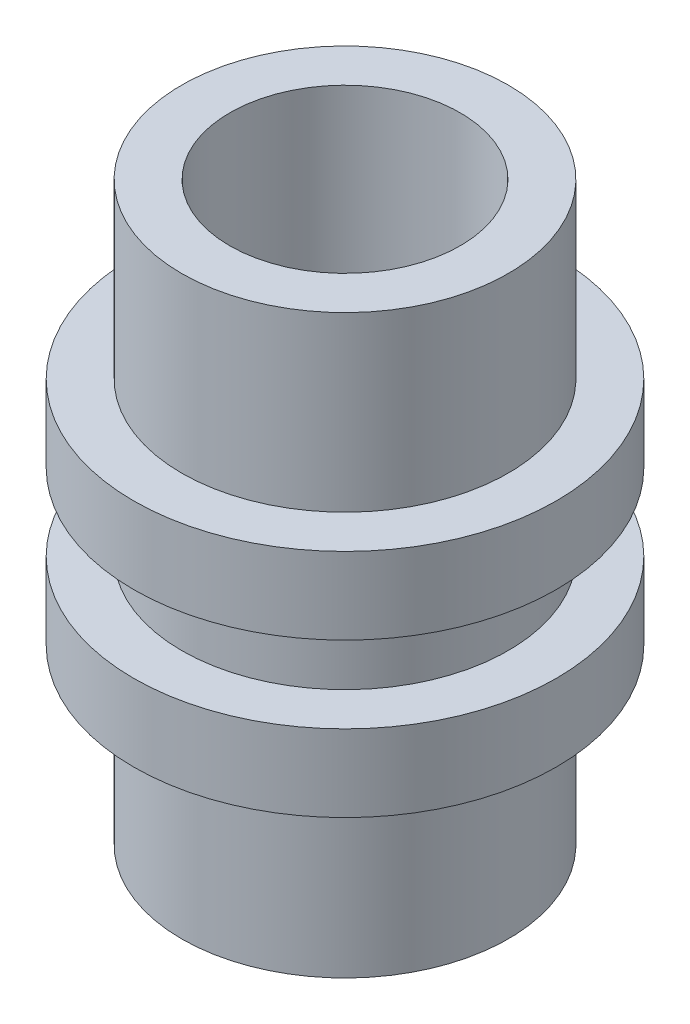
ISO-10303-21;
HEADER;
FILE_DESCRIPTION(('STEP AP214'),'2;1');
FILE_NAME('part.step','',(''),(''),'','','');
FILE_SCHEMA(('AUTOMOTIVE_DESIGN { 1 0 10303 214 1 1 1 1 }'));
ENDSEC;
DATA;
#1=APPLICATION_CONTEXT('core data for automotive mechanical design processes');
#2=APPLICATION_PROTOCOL_DEFINITION('international standard','automotive_design',2000,#1);
#3=PRODUCT_CONTEXT('',#1,'mechanical');
#4=PRODUCT('Part','Part','',(#3));
#5=PRODUCT_RELATED_PRODUCT_CATEGORY('part','',(#4));
#6=PRODUCT_DEFINITION_FORMATION('','',#4);
#7=PRODUCT_DEFINITION_CONTEXT('part definition',#1,'design');
#8=PRODUCT_DEFINITION('design','',#6,#7);
#9=PRODUCT_DEFINITION_SHAPE('','',#8);
#10=(LENGTH_UNIT() NAMED_UNIT(*) SI_UNIT(.MILLI.,.METRE.));
#11=(NAMED_UNIT(*) PLANE_ANGLE_UNIT() SI_UNIT($,.RADIAN.));
#12=(NAMED_UNIT(*) SI_UNIT($,.STERADIAN.) SOLID_ANGLE_UNIT());
#13=UNCERTAINTY_MEASURE_WITH_UNIT(LENGTH_MEASURE(1.E-05),#10,'distance_accuracy_value','');
#14=(GEOMETRIC_REPRESENTATION_CONTEXT(3) GLOBAL_UNCERTAINTY_ASSIGNED_CONTEXT((#13)) GLOBAL_UNIT_ASSIGNED_CONTEXT((#10,
#11,#12)) REPRESENTATION_CONTEXT('',''));
#15=CARTESIAN_POINT('',(0.,0.,0.));
#16=DIRECTION('',(0.,0.,1.));
#17=DIRECTION('',(1.,0.,0.));
#18=AXIS2_PLACEMENT_3D('',#15,#16,#17);
#19=CARTESIAN_POINT('',(0.,6.,0.));
#20=DIRECTION('',(0.,-1.,0.));
#21=DIRECTION('',(0.,0.,-1.));
#22=AXIS2_PLACEMENT_3D('',#19,#20,#21);
#23=CYLINDRICAL_SURFACE('',#22,5.5);
#24=CARTESIAN_POINT('',(0.,0.,0.));
#25=DIRECTION('',(0.,1.,0.));
#26=DIRECTION('',(0.,0.,1.));
#27=AXIS2_PLACEMENT_3D('',#24,#25,#26);
#28=CIRCLE('',#27,5.5);
#29=CARTESIAN_POINT('',(0.,0.,5.5));
#30=VERTEX_POINT('',#29);
#31=EDGE_CURVE('E52',#30,#30,#28,.T.);
#32=ORIENTED_EDGE('',*,*,#31,.T.);
#33=EDGE_LOOP('',(#32));
#34=FACE_BOUND('',#33,.T.);
#35=CARTESIAN_POINT('',(0.,2.,0.));
#36=DIRECTION('',(0.,1.,0.));
#37=DIRECTION('',(0.,0.,1.));
#38=AXIS2_PLACEMENT_3D('',#35,#36,#37);
#39=CIRCLE('',#38,5.5);
#40=CARTESIAN_POINT('',(0.,2.,5.5));
#41=VERTEX_POINT('',#40);
#42=EDGE_CURVE('E73',#41,#41,#39,.T.);
#43=ORIENTED_EDGE('',*,*,#42,.F.);
#44=EDGE_LOOP('',(#43));
#45=FACE_BOUND('',#44,.T.);
#46=ADVANCED_FACE('F32',(#34,#45),#23,.T.);
#47=CARTESIAN_POINT('',(0.,0.,0.));
#48=DIRECTION('',(0.,1.,0.));
#49=DIRECTION('',(0.,0.,1.));
#50=AXIS2_PLACEMENT_3D('',#47,#48,#49);
#51=PLANE('',#50);
#52=ORIENTED_EDGE('',*,*,#31,.F.);
#53=EDGE_LOOP('',(#52));
#54=FACE_BOUND('',#53,.T.);
#55=CARTESIAN_POINT('',(0.,0.,0.));
#56=DIRECTION('',(0.,1.,0.));
#57=DIRECTION('',(0.,0.,1.));
#58=AXIS2_PLACEMENT_3D('',#55,#56,#57);
#59=CIRCLE('',#58,4.25);
#60=CARTESIAN_POINT('',(0.,0.,4.25));
#61=VERTEX_POINT('',#60);
#62=EDGE_CURVE('E36',#61,#61,#59,.F.);
#63=ORIENTED_EDGE('',*,*,#62,.F.);
#64=EDGE_LOOP('',(#63));
#65=FACE_BOUND('',#64,.T.);
#66=ADVANCED_FACE('F105',(#54,#65),#51,.F.);
#67=CARTESIAN_POINT('',(0.,10.5,0.));
#68=DIRECTION('',(0.,-1.,0.));
#69=DIRECTION('',(0.,0.,-1.));
#70=AXIS2_PLACEMENT_3D('',#67,#68,#69);
#71=CYLINDRICAL_SURFACE('',#70,4.25);
#72=CARTESIAN_POINT('',(0.,-4.5,0.));
#73=DIRECTION('',(0.,1.,0.));
#74=DIRECTION('',(0.,0.,1.));
#75=AXIS2_PLACEMENT_3D('',#72,#73,#74);
#76=CIRCLE('',#75,4.25);
#77=CARTESIAN_POINT('',(0.,-4.5,4.25));
#78=VERTEX_POINT('',#77);
#79=EDGE_CURVE('E65',#78,#78,#76,.F.);
#80=ORIENTED_EDGE('',*,*,#79,.F.);
#81=EDGE_LOOP('',(#80));
#82=FACE_BOUND('',#81,.T.);
#83=ORIENTED_EDGE('',*,*,#62,.T.);
#84=EDGE_LOOP('',(#83));
#85=FACE_BOUND('',#84,.T.);
#86=ADVANCED_FACE('F110',(#82,#85),#71,.T.);
#87=CARTESIAN_POINT('',(0.,-4.5,0.));
#88=DIRECTION('',(0.,1.,0.));
#89=DIRECTION('',(0.,0.,1.));
#90=AXIS2_PLACEMENT_3D('',#87,#88,#89);
#91=PLANE('',#90);
#92=ORIENTED_EDGE('',*,*,#79,.T.);
#93=EDGE_LOOP('',(#92));
#94=FACE_BOUND('',#93,.T.);
#95=CARTESIAN_POINT('',(0.,-4.5,0.));
#96=DIRECTION('',(0.,1.,0.));
#97=DIRECTION('',(0.,0.,1.));
#98=AXIS2_PLACEMENT_3D('',#95,#96,#97);
#99=CIRCLE('',#98,3.);
#100=CARTESIAN_POINT('',(0.,-4.5,3.));
#101=VERTEX_POINT('',#100);
#102=EDGE_CURVE('E69',#101,#101,#99,.F.);
#103=ORIENTED_EDGE('',*,*,#102,.F.);
#104=EDGE_LOOP('',(#103));
#105=FACE_BOUND('',#104,.T.);
#106=ADVANCED_FACE('F137',(#94,#105),#91,.F.);
#107=CARTESIAN_POINT('',(0.,10.5,0.));
#108=DIRECTION('',(0.,-1.,0.));
#109=DIRECTION('',(0.,0.,-1.));
#110=AXIS2_PLACEMENT_3D('',#107,#108,#109);
#111=CYLINDRICAL_SURFACE('',#110,3.);
#112=ORIENTED_EDGE('',*,*,#102,.T.);
#113=EDGE_LOOP('',(#112));
#114=FACE_BOUND('',#113,.T.);
#115=CARTESIAN_POINT('',(0.,0.,0.));
#116=DIRECTION('',(0.,1.,0.));
#117=DIRECTION('',(0.,0.,1.));
#118=AXIS2_PLACEMENT_3D('',#115,#116,#117);
#119=CIRCLE('',#118,3.);
#120=CARTESIAN_POINT('',(0.,0.,3.));
#121=VERTEX_POINT('',#120);
#122=EDGE_CURVE('E53',#121,#121,#119,.F.);
#123=ORIENTED_EDGE('',*,*,#122,.F.);
#124=EDGE_LOOP('',(#123));
#125=FACE_BOUND('',#124,.T.);
#126=ADVANCED_FACE('F142',(#114,#125),#111,.F.);
#127=ORIENTED_EDGE('',*,*,#122,.T.);
#128=EDGE_LOOP('',(#127));
#129=FACE_BOUND('',#128,.T.);
#130=ADVANCED_FACE('F113',(#129),#51,.F.);
#131=CARTESIAN_POINT('',(0.,2.,0.));
#132=DIRECTION('',(0.,1.,0.));
#133=DIRECTION('',(0.,0.,1.));
#134=AXIS2_PLACEMENT_3D('',#131,#132,#133);
#135=PLANE('',#134);
#136=CARTESIAN_POINT('',(0.,2.,0.));
#137=DIRECTION('',(0.,1.,0.));
#138=DIRECTION('',(0.,0.,1.));
#139=AXIS2_PLACEMENT_3D('',#136,#137,#138);
#140=CIRCLE('',#139,4.25);
#141=CARTESIAN_POINT('',(0.,2.,4.25));
#142=VERTEX_POINT('',#141);
#143=EDGE_CURVE('E80',#142,#142,#140,.T.);
#144=ORIENTED_EDGE('',*,*,#143,.F.);
#145=EDGE_LOOP('',(#144));
#146=FACE_BOUND('',#145,.T.);
#147=ORIENTED_EDGE('',*,*,#42,.T.);
#148=EDGE_LOOP('',(#147));
#149=FACE_BOUND('',#148,.T.);
#150=ADVANCED_FACE('F102',(#146,#149),#135,.T.);
#151=CARTESIAN_POINT('',(0.,4.,0.));
#152=DIRECTION('',(0.,1.,0.));
#153=DIRECTION('',(0.,0.,1.));
#154=AXIS2_PLACEMENT_3D('',#151,#152,#153);
#155=PLANE('',#154);
#156=CARTESIAN_POINT('',(0.,4.,0.));
#157=DIRECTION('',(0.,1.,0.));
#158=DIRECTION('',(0.,0.,1.));
#159=AXIS2_PLACEMENT_3D('',#156,#157,#158);
#160=CIRCLE('',#159,4.25);
#161=CARTESIAN_POINT('',(0.,4.,4.25));
#162=VERTEX_POINT('',#161);
#163=EDGE_CURVE('E83',#162,#162,#160,.T.);
#164=ORIENTED_EDGE('',*,*,#163,.T.);
#165=EDGE_LOOP('',(#164));
#166=FACE_BOUND('',#165,.T.);
#167=CARTESIAN_POINT('',(0.,4.,0.));
#168=DIRECTION('',(0.,1.,0.));
#169=DIRECTION('',(0.,0.,1.));
#170=AXIS2_PLACEMENT_3D('',#167,#168,#169);
#171=CIRCLE('',#170,5.5);
#172=CARTESIAN_POINT('',(0.,4.,5.5));
#173=VERTEX_POINT('',#172);
#174=EDGE_CURVE('E77',#173,#173,#171,.T.);
#175=ORIENTED_EDGE('',*,*,#174,.F.);
#176=EDGE_LOOP('',(#175));
#177=FACE_BOUND('',#176,.T.);
#178=ADVANCED_FACE('F87',(#166,#177),#155,.F.);
#179=CARTESIAN_POINT('',(0.,2.,0.));
#180=DIRECTION('',(0.,1.,0.));
#181=DIRECTION('',(0.,0.,1.));
#182=AXIS2_PLACEMENT_3D('',#179,#180,#181);
#183=CYLINDRICAL_SURFACE('',#182,4.25);
#184=ORIENTED_EDGE('',*,*,#143,.T.);
#185=EDGE_LOOP('',(#184));
#186=FACE_BOUND('',#185,.T.);
#187=ORIENTED_EDGE('',*,*,#163,.F.);
#188=EDGE_LOOP('',(#187));
#189=FACE_BOUND('',#188,.T.);
#190=ADVANCED_FACE('F90',(#186,#189),#183,.T.);
#191=CARTESIAN_POINT('',(0.,6.,0.));
#192=DIRECTION('',(0.,1.,0.));
#193=DIRECTION('',(0.,0.,1.));
#194=AXIS2_PLACEMENT_3D('',#191,#192,#193);
#195=PLANE('',#194);
#196=CARTESIAN_POINT('',(0.,6.,0.));
#197=DIRECTION('',(0.,1.,0.));
#198=DIRECTION('',(0.,0.,1.));
#199=AXIS2_PLACEMENT_3D('',#196,#197,#198);
#200=CIRCLE('',#199,3.);
#201=CARTESIAN_POINT('',(0.,6.,3.));
#202=VERTEX_POINT('',#201);
#203=EDGE_CURVE('E11',#202,#202,#200,.F.);
#204=ORIENTED_EDGE('',*,*,#203,.F.);
#205=EDGE_LOOP('',(#204));
#206=FACE_BOUND('',#205,.T.);
#207=ADVANCED_FACE('F92',(#206),#195,.T.);
#208=ORIENTED_EDGE('',*,*,#203,.T.);
#209=EDGE_LOOP('',(#208));
#210=FACE_BOUND('',#209,.T.);
#211=CARTESIAN_POINT('',(0.,10.5,0.));
#212=DIRECTION('',(0.,1.,0.));
#213=DIRECTION('',(0.,0.,1.));
#214=AXIS2_PLACEMENT_3D('',#211,#212,#213);
#215=CIRCLE('',#214,3.);
#216=CARTESIAN_POINT('',(0.,10.5,3.));
#217=VERTEX_POINT('',#216);
#218=EDGE_CURVE('E61',#217,#217,#215,.T.);
#219=ORIENTED_EDGE('',*,*,#218,.T.);
#220=EDGE_LOOP('',(#219));
#221=FACE_BOUND('',#220,.T.);
#222=ADVANCED_FACE('F99',(#210,#221),#111,.F.);
#223=CARTESIAN_POINT('',(0.,10.5,0.));
#224=DIRECTION('',(0.,1.,0.));
#225=DIRECTION('',(0.,0.,1.));
#226=AXIS2_PLACEMENT_3D('',#223,#224,#225);
#227=PLANE('',#226);
#228=CARTESIAN_POINT('',(0.,10.5,0.));
#229=DIRECTION('',(0.,1.,0.));
#230=DIRECTION('',(0.,0.,1.));
#231=AXIS2_PLACEMENT_3D('',#228,#229,#230);
#232=CIRCLE('',#231,4.25);
#233=CARTESIAN_POINT('',(0.,10.5,4.25));
#234=VERTEX_POINT('',#233);
#235=EDGE_CURVE('E47',#234,#234,#232,.T.);
#236=ORIENTED_EDGE('',*,*,#235,.T.);
#237=EDGE_LOOP('',(#236));
#238=FACE_BOUND('',#237,.T.);
#239=ORIENTED_EDGE('',*,*,#218,.F.);
#240=EDGE_LOOP('',(#239));
#241=FACE_BOUND('',#240,.T.);
#242=ADVANCED_FACE('F130',(#238,#241),#227,.T.);
#243=CARTESIAN_POINT('',(0.,6.,0.));
#244=DIRECTION('',(0.,1.,0.));
#245=DIRECTION('',(0.,0.,1.));
#246=AXIS2_PLACEMENT_3D('',#243,#244,#245);
#247=CIRCLE('',#246,4.25);
#248=CARTESIAN_POINT('',(0.,6.,4.25));
#249=VERTEX_POINT('',#248);
#250=EDGE_CURVE('E49',#249,#249,#247,.F.);
#251=ORIENTED_EDGE('',*,*,#250,.F.);
#252=EDGE_LOOP('',(#251));
#253=FACE_BOUND('',#252,.T.);
#254=ORIENTED_EDGE('',*,*,#235,.F.);
#255=EDGE_LOOP('',(#254));
#256=FACE_BOUND('',#255,.T.);
#257=ADVANCED_FACE('F120',(#253,#256),#71,.T.);
#258=CARTESIAN_POINT('',(0.,6.,0.));
#259=DIRECTION('',(0.,1.,0.));
#260=DIRECTION('',(0.,0.,1.));
#261=AXIS2_PLACEMENT_3D('',#258,#259,#260);
#262=CIRCLE('',#261,5.5);
#263=CARTESIAN_POINT('',(0.,6.,5.5));
#264=VERTEX_POINT('',#263);
#265=EDGE_CURVE('E44',#264,#264,#262,.T.);
#266=ORIENTED_EDGE('',*,*,#265,.T.);
#267=EDGE_LOOP('',(#266));
#268=FACE_BOUND('',#267,.T.);
#269=ORIENTED_EDGE('',*,*,#250,.T.);
#270=EDGE_LOOP('',(#269));
#271=FACE_BOUND('',#270,.T.);
#272=ADVANCED_FACE('F101',(#268,#271),#195,.T.);
#273=ORIENTED_EDGE('',*,*,#174,.T.);
#274=EDGE_LOOP('',(#273));
#275=FACE_BOUND('',#274,.T.);
#276=ORIENTED_EDGE('',*,*,#265,.F.);
#277=EDGE_LOOP('',(#276));
#278=FACE_BOUND('',#277,.T.);
#279=ADVANCED_FACE('F34',(#275,#278),#23,.T.);
#280=CLOSED_SHELL('',(#46,#66,#86,#106,#126,#130,#150,#178,#190,#207,#222,#242,#257,#272,#279));
#281=MANIFOLD_SOLID_BREP('B2',#280);
#282=ADVANCED_BREP_SHAPE_REPRESENTATION('',(#18,#281),#14);
#283=SHAPE_DEFINITION_REPRESENTATION(#9,#282);
ENDSEC;
END-ISO-10303-21;
